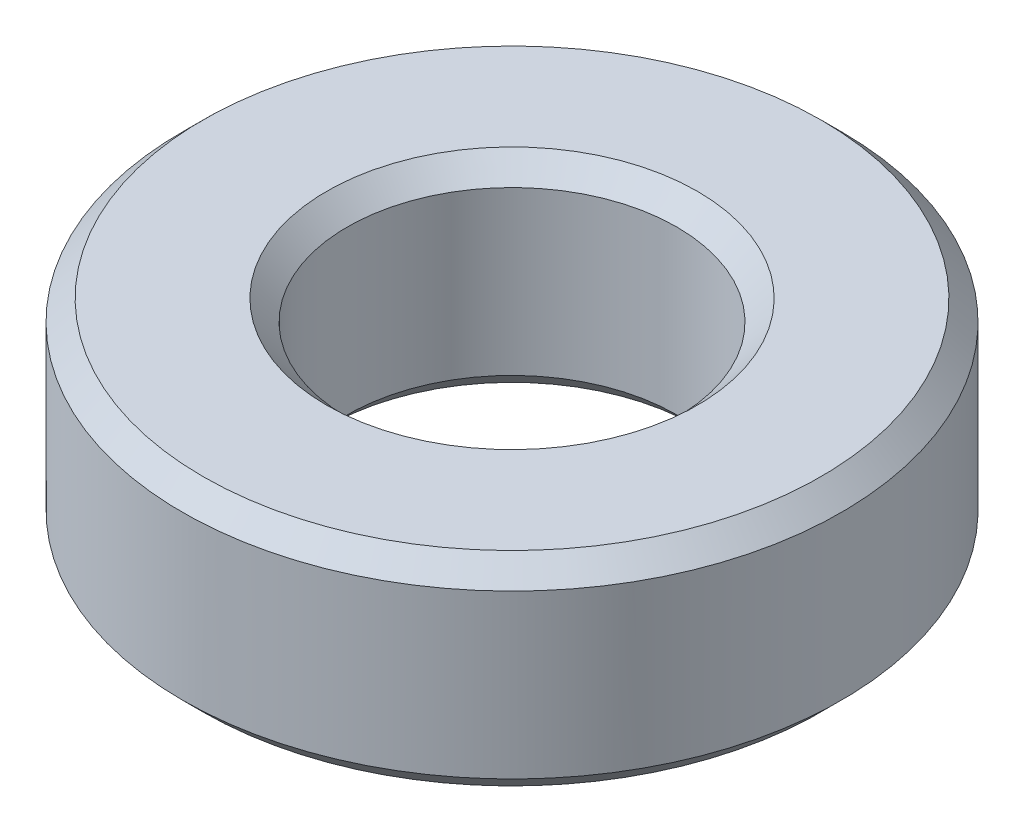
ISO-10303-21;
HEADER;
FILE_DESCRIPTION(('STEP AP214'),'2;1');
FILE_NAME('part.step','',(''),(''),'','','');
FILE_SCHEMA(('AUTOMOTIVE_DESIGN { 1 0 10303 214 1 1 1 1 }'));
ENDSEC;
DATA;
#1=APPLICATION_CONTEXT('core data for automotive mechanical design processes');
#2=APPLICATION_PROTOCOL_DEFINITION('international standard','automotive_design',2000,#1);
#3=PRODUCT_CONTEXT('',#1,'mechanical');
#4=PRODUCT('Part','Part','',(#3));
#5=PRODUCT_RELATED_PRODUCT_CATEGORY('part','',(#4));
#6=PRODUCT_DEFINITION_FORMATION('','',#4);
#7=PRODUCT_DEFINITION_CONTEXT('part definition',#1,'design');
#8=PRODUCT_DEFINITION('design','',#6,#7);
#9=PRODUCT_DEFINITION_SHAPE('','',#8);
#10=(LENGTH_UNIT() NAMED_UNIT(*) SI_UNIT(.MILLI.,.METRE.));
#11=(NAMED_UNIT(*) PLANE_ANGLE_UNIT() SI_UNIT($,.RADIAN.));
#12=(NAMED_UNIT(*) SI_UNIT($,.STERADIAN.) SOLID_ANGLE_UNIT());
#13=UNCERTAINTY_MEASURE_WITH_UNIT(LENGTH_MEASURE(1.E-05),#10,'distance_accuracy_value','');
#14=(GEOMETRIC_REPRESENTATION_CONTEXT(3) GLOBAL_UNCERTAINTY_ASSIGNED_CONTEXT((#13)) GLOBAL_UNIT_ASSIGNED_CONTEXT((#10,
#11,#12)) REPRESENTATION_CONTEXT('',''));
#15=CARTESIAN_POINT('',(0.,0.,0.));
#16=DIRECTION('',(0.,0.,1.));
#17=DIRECTION('',(1.,0.,0.));
#18=AXIS2_PLACEMENT_3D('',#15,#16,#17);
#19=CARTESIAN_POINT('',(0.,4.95,0.));
#20=DIRECTION('',(0.,1.,0.));
#21=DIRECTION('',(0.,0.,1.));
#22=AXIS2_PLACEMENT_3D('',#19,#20,#21);
#23=PLANE('',#22);
#24=CARTESIAN_POINT('',(0.,4.95,0.));
#25=DIRECTION('',(0.,1.,0.));
#26=DIRECTION('',(0.,0.,1.));
#27=AXIS2_PLACEMENT_3D('',#24,#25,#26);
#28=CIRCLE('',#27,4.50000000000001);
#29=CARTESIAN_POINT('',(0.,4.95,4.50000000000001));
#30=VERTEX_POINT('',#29);
#31=EDGE_CURVE('E10',#30,#30,#28,.F.);
#32=ORIENTED_EDGE('',*,*,#31,.T.);
#33=EDGE_LOOP('',(#32));
#34=FACE_BOUND('',#33,.T.);
#35=CARTESIAN_POINT('',(0.,4.95,0.));
#36=DIRECTION('',(0.,1.,0.));
#37=DIRECTION('',(0.,0.,1.));
#38=AXIS2_PLACEMENT_3D('',#35,#36,#37);
#39=CIRCLE('',#38,7.50000000000001);
#40=CARTESIAN_POINT('',(0.,4.95,7.50000000000001));
#41=VERTEX_POINT('',#40);
#42=EDGE_CURVE('E38',#41,#41,#39,.T.);
#43=ORIENTED_EDGE('',*,*,#42,.T.);
#44=EDGE_LOOP('',(#43));
#45=FACE_BOUND('',#44,.T.);
#46=ADVANCED_FACE('F31',(#34,#45),#23,.T.);
#47=CARTESIAN_POINT('',(0.,0.,0.));
#48=DIRECTION('',(0.,1.,0.));
#49=DIRECTION('',(0.,0.,1.));
#50=AXIS2_PLACEMENT_3D('',#47,#48,#49);
#51=PLANE('',#50);
#52=CARTESIAN_POINT('',(0.,0.,0.));
#53=DIRECTION('',(0.,1.,0.));
#54=DIRECTION('',(0.,0.,1.));
#55=AXIS2_PLACEMENT_3D('',#52,#53,#54);
#56=CIRCLE('',#55,4.49999999999999);
#57=CARTESIAN_POINT('',(0.,0.,4.49999999999999));
#58=VERTEX_POINT('',#57);
#59=EDGE_CURVE('E57',#58,#58,#56,.T.);
#60=ORIENTED_EDGE('',*,*,#59,.T.);
#61=EDGE_LOOP('',(#60));
#62=FACE_BOUND('',#61,.T.);
#63=CARTESIAN_POINT('',(0.,0.,0.));
#64=DIRECTION('',(0.,1.,0.));
#65=DIRECTION('',(0.,0.,1.));
#66=AXIS2_PLACEMENT_3D('',#63,#64,#65);
#67=CIRCLE('',#66,7.49999999999998);
#68=CARTESIAN_POINT('',(0.,0.,7.49999999999998));
#69=VERTEX_POINT('',#68);
#70=EDGE_CURVE('E60',#69,#69,#67,.F.);
#71=ORIENTED_EDGE('',*,*,#70,.T.);
#72=EDGE_LOOP('',(#71));
#73=FACE_BOUND('',#72,.T.);
#74=ADVANCED_FACE('F64',(#62,#73),#51,.F.);
#75=CARTESIAN_POINT('',(0.,4.95,0.));
#76=DIRECTION('',(0.,-1.,0.));
#77=DIRECTION('',(0.,0.,-1.));
#78=AXIS2_PLACEMENT_3D('',#75,#76,#77);
#79=CYLINDRICAL_SURFACE('',#78,8.);
#80=CARTESIAN_POINT('',(0.,0.500000000000013,0.));
#81=DIRECTION('',(0.,1.,0.));
#82=DIRECTION('',(0.,0.,1.));
#83=AXIS2_PLACEMENT_3D('',#80,#81,#82);
#84=CIRCLE('',#83,8.);
#85=CARTESIAN_POINT('',(0.,0.500000000000013,-8.));
#86=VERTEX_POINT('',#85);
#87=EDGE_CURVE('E42',#86,#86,#84,.T.);
#88=CARTESIAN_POINT('',(0.,4.45000000000001,0.));
#89=DIRECTION('',(0.,1.,0.));
#90=DIRECTION('',(0.,0.,1.));
#91=AXIS2_PLACEMENT_3D('',#88,#89,#90);
#92=CIRCLE('',#91,8.);
#93=CARTESIAN_POINT('',(0.,4.45000000000001,-8.));
#94=VERTEX_POINT('',#93);
#95=EDGE_CURVE('E46',#94,#94,#92,.F.);
#96=CARTESIAN_POINT('',(0.,0.500000000000013,-8.));
#97=CARTESIAN_POINT('',(0.,0.541145833333346,-8.));
#98=CARTESIAN_POINT('',(0.,0.582291666666679,-8.));
#99=CARTESIAN_POINT('',(0.,0.664583333333346,-8.));
#100=CARTESIAN_POINT('',(0.,0.705729166666679,-8.));
#101=CARTESIAN_POINT('',(0.,0.788020833333346,-8.));
#102=CARTESIAN_POINT('',(0.,0.829166666666679,-8.));
#103=CARTESIAN_POINT('',(0.,0.911458333333346,-8.));
#104=CARTESIAN_POINT('',(0.,0.952604166666679,-8.));
#105=CARTESIAN_POINT('',(0.,1.03489583333335,-8.));
#106=CARTESIAN_POINT('',(0.,1.07604166666668,-8.));
#107=CARTESIAN_POINT('',(0.,1.15833333333335,-8.));
#108=CARTESIAN_POINT('',(0.,1.19947916666668,-8.));
#109=CARTESIAN_POINT('',(0.,1.28177083333335,-8.));
#110=CARTESIAN_POINT('',(0.,1.32291666666668,-8.));
#111=CARTESIAN_POINT('',(0.,1.40520833333334,-8.));
#112=CARTESIAN_POINT('',(0.,1.44635416666668,-8.));
#113=CARTESIAN_POINT('',(0.,1.52864583333334,-8.));
#114=CARTESIAN_POINT('',(0.,1.56979166666668,-8.));
#115=CARTESIAN_POINT('',(0.,1.65208333333334,-8.));
#116=CARTESIAN_POINT('',(0.,1.69322916666668,-8.));
#117=CARTESIAN_POINT('',(0.,1.77552083333334,-8.));
#118=CARTESIAN_POINT('',(0.,1.81666666666668,-8.));
#119=CARTESIAN_POINT('',(0.,1.89895833333334,-8.));
#120=CARTESIAN_POINT('',(0.,1.94010416666668,-8.));
#121=CARTESIAN_POINT('',(0.,2.02239583333334,-8.));
#122=CARTESIAN_POINT('',(0.,2.06354166666668,-8.));
#123=CARTESIAN_POINT('',(0.,2.14583333333334,-8.));
#124=CARTESIAN_POINT('',(0.,2.18697916666668,-8.));
#125=CARTESIAN_POINT('',(0.,2.26927083333334,-8.));
#126=CARTESIAN_POINT('',(0.,2.31041666666668,-8.));
#127=CARTESIAN_POINT('',(0.,2.39270833333334,-8.));
#128=CARTESIAN_POINT('',(0.,2.43385416666668,-8.));
#129=CARTESIAN_POINT('',(0.,2.51614583333334,-8.));
#130=CARTESIAN_POINT('',(0.,2.55729166666668,-8.));
#131=CARTESIAN_POINT('',(0.,2.63958333333334,-8.));
#132=CARTESIAN_POINT('',(0.,2.68072916666668,-8.));
#133=CARTESIAN_POINT('',(0.,2.76302083333334,-8.));
#134=CARTESIAN_POINT('',(0.,2.80416666666668,-8.));
#135=CARTESIAN_POINT('',(0.,2.88645833333334,-8.));
#136=CARTESIAN_POINT('',(0.,2.92760416666668,-8.));
#137=CARTESIAN_POINT('',(0.,3.00989583333334,-8.));
#138=CARTESIAN_POINT('',(0.,3.05104166666668,-8.));
#139=CARTESIAN_POINT('',(0.,3.13333333333334,-8.));
#140=CARTESIAN_POINT('',(0.,3.17447916666668,-8.));
#141=CARTESIAN_POINT('',(0.,3.25677083333334,-8.));
#142=CARTESIAN_POINT('',(0.,3.29791666666668,-8.));
#143=CARTESIAN_POINT('',(0.,3.38020833333334,-8.));
#144=CARTESIAN_POINT('',(0.,3.42135416666668,-8.));
#145=CARTESIAN_POINT('',(0.,3.50364583333334,-8.));
#146=CARTESIAN_POINT('',(0.,3.54479166666668,-8.));
#147=CARTESIAN_POINT('',(0.,3.62708333333334,-8.));
#148=CARTESIAN_POINT('',(0.,3.66822916666668,-8.));
#149=CARTESIAN_POINT('',(0.,3.75052083333334,-8.));
#150=CARTESIAN_POINT('',(0.,3.79166666666668,-8.));
#151=CARTESIAN_POINT('',(0.,3.87395833333334,-8.));
#152=CARTESIAN_POINT('',(0.,3.91510416666668,-8.));
#153=CARTESIAN_POINT('',(0.,3.99739583333334,-8.));
#154=CARTESIAN_POINT('',(0.,4.03854166666668,-8.));
#155=CARTESIAN_POINT('',(0.,4.12083333333334,-8.));
#156=CARTESIAN_POINT('',(0.,4.16197916666668,-8.));
#157=CARTESIAN_POINT('',(0.,4.24427083333334,-8.));
#158=CARTESIAN_POINT('',(0.,4.28541666666668,-8.));
#159=CARTESIAN_POINT('',(0.,4.36770833333334,-8.));
#160=CARTESIAN_POINT('',(0.,4.40885416666668,-8.));
#161=CARTESIAN_POINT('',(0.,4.45000000000001,-8.));
#162=B_SPLINE_CURVE_WITH_KNOTS('',3,(#96,#97,#98,#99,#100,#101,#102,#103,#104,#105,#106,#107,
#108,#109,#110,#111,#112,#113,#114,#115,#116,#117,#118,#119,#120,#121,#122,#123,#124,#125,#126,
#127,#128,#129,#130,#131,#132,#133,#134,#135,#136,#137,#138,#139,#140,#141,#142,#143,#144,#145,
#146,#147,#148,#149,#150,#151,#152,#153,#154,#155,#156,#157,#158,#159,#160,#161),.UNSPECIFIED.,
.F.,.F.,(4,2,2,2,2,2,2,2,2,2,2,2,2,2,2,2,2,2,2,2,2,2,2,2,2,2,2,2,2,2,2,2,4),(0.,0.1234375,
0.246875,0.3703125,0.493749999999999,0.617187499999999,0.740624999999999,0.864062499999999,
0.987499999999999,1.1109375,1.234375,1.3578125,1.48125,1.6046875,1.728125,1.8515625,1.975,
2.0984375,2.221875,2.3453125,2.46875,2.5921875,2.715625,2.8390625,2.9625,3.0859375,3.209375,
3.3328125,3.45625,3.5796875,3.703125,3.8265625,3.95),.UNSPECIFIED.);
#163=EDGE_CURVE('BSEAM74',#86,#94,#162,.T.);
#164=ORIENTED_EDGE('',*,*,#87,.T.);
#165=ORIENTED_EDGE('',*,*,#95,.T.);
#166=ORIENTED_EDGE('',*,*,#163,.T.);
#167=ORIENTED_EDGE('',*,*,#163,.F.);
#168=EDGE_LOOP('',(#164,#166,#165,#167));
#169=FACE_BOUND('',#168,.T.);
#170=ADVANCED_FACE('F74',(#169),#79,.T.);
#171=CARTESIAN_POINT('',(0.,4.95,0.));
#172=DIRECTION('',(0.,-1.,0.));
#173=DIRECTION('',(0.,0.,-1.));
#174=AXIS2_PLACEMENT_3D('',#171,#172,#173);
#175=CYLINDRICAL_SURFACE('',#174,4.);
#176=CARTESIAN_POINT('',(0.,0.499999999999994,0.));
#177=DIRECTION('',(0.,1.,0.));
#178=DIRECTION('',(0.,0.,1.));
#179=AXIS2_PLACEMENT_3D('',#176,#177,#178);
#180=CIRCLE('',#179,4.);
#181=CARTESIAN_POINT('',(0.,0.499999999999994,-4.));
#182=VERTEX_POINT('',#181);
#183=EDGE_CURVE('E51',#182,#182,#180,.F.);
#184=CARTESIAN_POINT('',(0.,4.44999999999999,0.));
#185=DIRECTION('',(0.,1.,0.));
#186=DIRECTION('',(0.,0.,1.));
#187=AXIS2_PLACEMENT_3D('',#184,#185,#186);
#188=CIRCLE('',#187,4.);
#189=CARTESIAN_POINT('',(0.,4.44999999999999,-4.));
#190=VERTEX_POINT('',#189);
#191=EDGE_CURVE('E54',#190,#190,#188,.T.);
#192=CARTESIAN_POINT('',(0.,0.499999999999994,-4.));
#193=CARTESIAN_POINT('',(0.,0.541145833333327,-4.));
#194=CARTESIAN_POINT('',(0.,0.58229166666666,-4.));
#195=CARTESIAN_POINT('',(0.,0.664583333333327,-4.));
#196=CARTESIAN_POINT('',(0.,0.70572916666666,-4.));
#197=CARTESIAN_POINT('',(0.,0.788020833333327,-4.));
#198=CARTESIAN_POINT('',(0.,0.82916666666666,-4.));
#199=CARTESIAN_POINT('',(0.,0.911458333333327,-4.));
#200=CARTESIAN_POINT('',(0.,0.95260416666666,-4.));
#201=CARTESIAN_POINT('',(0.,1.03489583333333,-4.));
#202=CARTESIAN_POINT('',(0.,1.07604166666666,-4.));
#203=CARTESIAN_POINT('',(0.,1.15833333333333,-4.));
#204=CARTESIAN_POINT('',(0.,1.19947916666666,-4.));
#205=CARTESIAN_POINT('',(0.,1.28177083333333,-4.));
#206=CARTESIAN_POINT('',(0.,1.32291666666666,-4.));
#207=CARTESIAN_POINT('',(0.,1.40520833333333,-4.));
#208=CARTESIAN_POINT('',(0.,1.44635416666666,-4.));
#209=CARTESIAN_POINT('',(0.,1.52864583333333,-4.));
#210=CARTESIAN_POINT('',(0.,1.56979166666666,-4.));
#211=CARTESIAN_POINT('',(0.,1.65208333333333,-4.));
#212=CARTESIAN_POINT('',(0.,1.69322916666666,-4.));
#213=CARTESIAN_POINT('',(0.,1.77552083333333,-4.));
#214=CARTESIAN_POINT('',(0.,1.81666666666666,-4.));
#215=CARTESIAN_POINT('',(0.,1.89895833333333,-4.));
#216=CARTESIAN_POINT('',(0.,1.94010416666666,-4.));
#217=CARTESIAN_POINT('',(0.,2.02239583333333,-4.));
#218=CARTESIAN_POINT('',(0.,2.06354166666666,-4.));
#219=CARTESIAN_POINT('',(0.,2.14583333333333,-4.));
#220=CARTESIAN_POINT('',(0.,2.18697916666666,-4.));
#221=CARTESIAN_POINT('',(0.,2.26927083333333,-4.));
#222=CARTESIAN_POINT('',(0.,2.31041666666666,-4.));
#223=CARTESIAN_POINT('',(0.,2.39270833333333,-4.));
#224=CARTESIAN_POINT('',(0.,2.43385416666666,-4.));
#225=CARTESIAN_POINT('',(0.,2.51614583333333,-4.));
#226=CARTESIAN_POINT('',(0.,2.55729166666666,-4.));
#227=CARTESIAN_POINT('',(0.,2.63958333333333,-4.));
#228=CARTESIAN_POINT('',(0.,2.68072916666666,-4.));
#229=CARTESIAN_POINT('',(0.,2.76302083333333,-4.));
#230=CARTESIAN_POINT('',(0.,2.80416666666666,-4.));
#231=CARTESIAN_POINT('',(0.,2.88645833333333,-4.));
#232=CARTESIAN_POINT('',(0.,2.92760416666666,-4.));
#233=CARTESIAN_POINT('',(0.,3.00989583333333,-4.));
#234=CARTESIAN_POINT('',(0.,3.05104166666666,-4.));
#235=CARTESIAN_POINT('',(0.,3.13333333333333,-4.));
#236=CARTESIAN_POINT('',(0.,3.17447916666666,-4.));
#237=CARTESIAN_POINT('',(0.,3.25677083333333,-4.));
#238=CARTESIAN_POINT('',(0.,3.29791666666666,-4.));
#239=CARTESIAN_POINT('',(0.,3.38020833333333,-4.));
#240=CARTESIAN_POINT('',(0.,3.42135416666666,-4.));
#241=CARTESIAN_POINT('',(0.,3.50364583333333,-4.));
#242=CARTESIAN_POINT('',(0.,3.54479166666666,-4.));
#243=CARTESIAN_POINT('',(0.,3.62708333333333,-4.));
#244=CARTESIAN_POINT('',(0.,3.66822916666666,-4.));
#245=CARTESIAN_POINT('',(0.,3.75052083333333,-4.));
#246=CARTESIAN_POINT('',(0.,3.79166666666666,-4.));
#247=CARTESIAN_POINT('',(0.,3.87395833333333,-4.));
#248=CARTESIAN_POINT('',(0.,3.91510416666666,-4.));
#249=CARTESIAN_POINT('',(0.,3.99739583333333,-4.));
#250=CARTESIAN_POINT('',(0.,4.03854166666666,-4.));
#251=CARTESIAN_POINT('',(0.,4.12083333333333,-4.));
#252=CARTESIAN_POINT('',(0.,4.16197916666666,-4.));
#253=CARTESIAN_POINT('',(0.,4.24427083333333,-4.));
#254=CARTESIAN_POINT('',(0.,4.28541666666666,-4.));
#255=CARTESIAN_POINT('',(0.,4.36770833333333,-4.));
#256=CARTESIAN_POINT('',(0.,4.40885416666666,-4.));
#257=CARTESIAN_POINT('',(0.,4.44999999999999,-4.));
#258=B_SPLINE_CURVE_WITH_KNOTS('',3,(#192,#193,#194,#195,#196,#197,#198,#199,#200,#201,#202,
#203,#204,#205,#206,#207,#208,#209,#210,#211,#212,#213,#214,#215,#216,#217,#218,#219,#220,#221,
#222,#223,#224,#225,#226,#227,#228,#229,#230,#231,#232,#233,#234,#235,#236,#237,#238,#239,#240,
#241,#242,#243,#244,#245,#246,#247,#248,#249,#250,#251,#252,#253,#254,#255,#256,#257),
.UNSPECIFIED.,.F.,.F.,(4,2,2,2,2,2,2,2,2,2,2,2,2,2,2,2,2,2,2,2,2,2,2,2,2,2,2,2,2,2,2,2,4),(0.,
0.1234375,0.246875,0.3703125,0.49375,0.6171875,0.740625,0.8640625,0.9875,1.1109375,1.234375,
1.3578125,1.48125,1.6046875,1.728125,1.8515625,1.975,2.0984375,2.221875,2.3453125,2.46875,
2.5921875,2.715625,2.8390625,2.9625,3.0859375,3.209375,3.3328125,3.45625,3.5796875,3.703125,
3.8265625,3.95),.UNSPECIFIED.);
#259=EDGE_CURVE('BSEAM77',#182,#190,#258,.T.);
#260=ORIENTED_EDGE('',*,*,#183,.T.);
#261=ORIENTED_EDGE('',*,*,#191,.T.);
#262=ORIENTED_EDGE('',*,*,#259,.T.);
#263=ORIENTED_EDGE('',*,*,#259,.F.);
#264=EDGE_LOOP('',(#260,#262,#261,#263));
#265=FACE_BOUND('',#264,.T.);
#266=ADVANCED_FACE('F77',(#265),#175,.F.);
#267=CARTESIAN_POINT('',(0.,0.,0.));
#268=DIRECTION('',(0.,-1.,0.));
#269=DIRECTION('',(0.,0.,-1.));
#270=AXIS2_PLACEMENT_3D('',#267,#268,#269);
#271=CONICAL_SURFACE('',#270,4.49999999999999,0.785398163397445);
#272=ORIENTED_EDGE('',*,*,#183,.F.);
#273=EDGE_LOOP('',(#272));
#274=FACE_BOUND('',#273,.T.);
#275=ORIENTED_EDGE('',*,*,#59,.F.);
#276=EDGE_LOOP('',(#275));
#277=FACE_BOUND('',#276,.T.);
#278=ADVANCED_FACE('F70',(#274,#277),#271,.F.);
#279=CARTESIAN_POINT('',(0.,0.500000000000013,0.));
#280=DIRECTION('',(0.,1.,0.));
#281=DIRECTION('',(0.,0.,1.));
#282=AXIS2_PLACEMENT_3D('',#279,#280,#281);
#283=CONICAL_SURFACE('',#282,8.,0.785398163397452);
#284=ORIENTED_EDGE('',*,*,#70,.F.);
#285=EDGE_LOOP('',(#284));
#286=FACE_BOUND('',#285,.T.);
#287=ORIENTED_EDGE('',*,*,#87,.F.);
#288=EDGE_LOOP('',(#287));
#289=FACE_BOUND('',#288,.T.);
#290=ADVANCED_FACE('F66',(#286,#289),#283,.T.);
#291=CARTESIAN_POINT('',(0.,4.44999999999999,0.));
#292=DIRECTION('',(0.,1.,0.));
#293=DIRECTION('',(0.,0.,1.));
#294=AXIS2_PLACEMENT_3D('',#291,#292,#293);
#295=CONICAL_SURFACE('',#294,4.,0.785398163397448);
#296=ORIENTED_EDGE('',*,*,#31,.F.);
#297=EDGE_LOOP('',(#296));
#298=FACE_BOUND('',#297,.T.);
#299=ORIENTED_EDGE('',*,*,#191,.F.);
#300=EDGE_LOOP('',(#299));
#301=FACE_BOUND('',#300,.T.);
#302=ADVANCED_FACE('F69',(#298,#301),#295,.F.);
#303=CARTESIAN_POINT('',(0.,4.95,0.));
#304=DIRECTION('',(0.,-1.,0.));
#305=DIRECTION('',(0.,0.,-1.));
#306=AXIS2_PLACEMENT_3D('',#303,#304,#305);
#307=CONICAL_SURFACE('',#306,7.50000000000001,0.785398163397448);
#308=ORIENTED_EDGE('',*,*,#95,.F.);
#309=EDGE_LOOP('',(#308));
#310=FACE_BOUND('',#309,.T.);
#311=ORIENTED_EDGE('',*,*,#42,.F.);
#312=EDGE_LOOP('',(#311));
#313=FACE_BOUND('',#312,.T.);
#314=ADVANCED_FACE('F33',(#310,#313),#307,.T.);
#315=CLOSED_SHELL('',(#46,#74,#170,#266,#278,#290,#302,#314));
#316=MANIFOLD_SOLID_BREP('B2',#315);
#317=ADVANCED_BREP_SHAPE_REPRESENTATION('',(#18,#316),#14);
#318=SHAPE_DEFINITION_REPRESENTATION(#9,#317);
ENDSEC;
END-ISO-10303-21;
